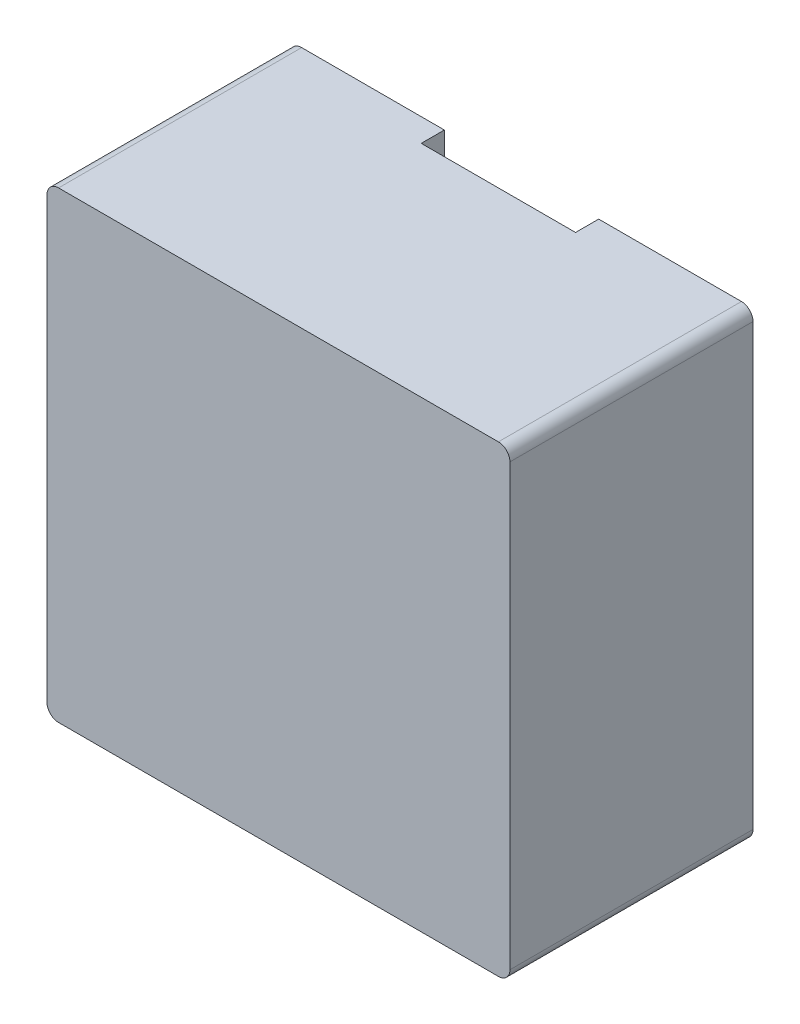
ISO-10303-21;
HEADER;
FILE_DESCRIPTION(('STEP AP214'),'2;1');
FILE_NAME('part.step','',(''),(''),'','','');
FILE_SCHEMA(('AUTOMOTIVE_DESIGN { 1 0 10303 214 1 1 1 1 }'));
ENDSEC;
DATA;
#1=APPLICATION_CONTEXT('core data for automotive mechanical design processes');
#2=APPLICATION_PROTOCOL_DEFINITION('international standard','automotive_design',2000,#1);
#3=PRODUCT_CONTEXT('',#1,'mechanical');
#4=PRODUCT('Part','Part','',(#3));
#5=PRODUCT_RELATED_PRODUCT_CATEGORY('part','',(#4));
#6=PRODUCT_DEFINITION_FORMATION('','',#4);
#7=PRODUCT_DEFINITION_CONTEXT('part definition',#1,'design');
#8=PRODUCT_DEFINITION('design','',#6,#7);
#9=PRODUCT_DEFINITION_SHAPE('','',#8);
#10=(LENGTH_UNIT() NAMED_UNIT(*) SI_UNIT(.MILLI.,.METRE.));
#11=(NAMED_UNIT(*) PLANE_ANGLE_UNIT() SI_UNIT($,.RADIAN.));
#12=(NAMED_UNIT(*) SI_UNIT($,.STERADIAN.) SOLID_ANGLE_UNIT());
#13=UNCERTAINTY_MEASURE_WITH_UNIT(LENGTH_MEASURE(1.E-05),#10,'distance_accuracy_value','');
#14=(GEOMETRIC_REPRESENTATION_CONTEXT(3) GLOBAL_UNCERTAINTY_ASSIGNED_CONTEXT((#13)) GLOBAL_UNIT_ASSIGNED_CONTEXT((#10,
#11,#12)) REPRESENTATION_CONTEXT('',''));
#15=CARTESIAN_POINT('',(0.,0.,0.));
#16=DIRECTION('',(0.,0.,1.));
#17=DIRECTION('',(1.,0.,0.));
#18=AXIS2_PLACEMENT_3D('',#15,#16,#17);
#19=CARTESIAN_POINT('',(0.,0.,0.));
#20=DIRECTION('',(0.,0.,-1.));
#21=DIRECTION('',(-1.,0.,0.));
#22=AXIS2_PLACEMENT_3D('',#19,#20,#21);
#23=PLANE('',#22);
#24=DIRECTION('',(0.,1.,0.));
#25=VECTOR('',#24,1.);
#26=CARTESIAN_POINT('',(-3.,-3.,0.));
#27=LINE('',#26,#25);
#28=CARTESIAN_POINT('',(-3.,-2.85,0.));
#29=VERTEX_POINT('',#28);
#30=CARTESIAN_POINT('',(-3.,2.85,0.));
#31=VERTEX_POINT('',#30);
#32=EDGE_CURVE('E185',#29,#31,#27,.T.);
#33=ORIENTED_EDGE('',*,*,#32,.T.);
#34=CARTESIAN_POINT('',(-2.85,2.85,0.));
#35=DIRECTION('',(0.,0.,-1.));
#36=DIRECTION('',(-1.,0.,0.));
#37=AXIS2_PLACEMENT_3D('',#34,#35,#36);
#38=CIRCLE('',#37,0.15);
#39=CARTESIAN_POINT('',(-2.85,3.,0.));
#40=VERTEX_POINT('',#39);
#41=EDGE_CURVE('E130',#31,#40,#38,.T.);
#42=ORIENTED_EDGE('',*,*,#41,.T.);
#43=DIRECTION('',(1.,0.,0.));
#44=VECTOR('',#43,1.);
#45=CARTESIAN_POINT('',(-3.,3.,0.));
#46=LINE('',#45,#44);
#47=CARTESIAN_POINT('',(-1.,3.,0.));
#48=VERTEX_POINT('',#47);
#49=EDGE_CURVE('E124',#40,#48,#46,.T.);
#50=ORIENTED_EDGE('',*,*,#49,.T.);
#51=DIRECTION('',(0.,-1.,0.));
#52=VECTOR('',#51,1.);
#53=CARTESIAN_POINT('',(-1.,3.,0.));
#54=LINE('',#53,#52);
#55=CARTESIAN_POINT('',(-1.,-3.,0.));
#56=VERTEX_POINT('',#55);
#57=EDGE_CURVE('E128',#48,#56,#54,.T.);
#58=ORIENTED_EDGE('',*,*,#57,.T.);
#59=DIRECTION('',(-1.,0.,0.));
#60=VECTOR('',#59,1.);
#61=CARTESIAN_POINT('',(3.,-3.,0.));
#62=LINE('',#61,#60);
#63=CARTESIAN_POINT('',(-2.85,-3.,0.));
#64=VERTEX_POINT('',#63);
#65=EDGE_CURVE('E182',#56,#64,#62,.T.);
#66=ORIENTED_EDGE('',*,*,#65,.T.);
#67=CARTESIAN_POINT('',(-2.85,-2.85,0.));
#68=DIRECTION('',(0.,0.,-1.));
#69=DIRECTION('',(-1.,0.,0.));
#70=AXIS2_PLACEMENT_3D('',#67,#68,#69);
#71=CIRCLE('',#70,0.15);
#72=EDGE_CURVE('E191',#64,#29,#71,.T.);
#73=ORIENTED_EDGE('',*,*,#72,.T.);
#74=EDGE_LOOP('',(#33,#42,#50,#58,#66,#73));
#75=FACE_BOUND('',#74,.T.);
#76=ADVANCED_FACE('F34',(#75),#23,.T.);
#77=CARTESIAN_POINT('',(3.,3.,3.15));
#78=DIRECTION('',(1.,0.,0.));
#79=DIRECTION('',(0.,0.,-1.));
#80=AXIS2_PLACEMENT_3D('',#77,#78,#79);
#81=PLANE('',#80);
#82=DIRECTION('',(0.,-1.,0.));
#83=VECTOR('',#82,1.);
#84=CARTESIAN_POINT('',(3.,3.,0.));
#85=LINE('',#84,#83);
#86=CARTESIAN_POINT('',(3.,2.85,0.));
#87=VERTEX_POINT('',#86);
#88=CARTESIAN_POINT('',(3.,-2.85,0.));
#89=VERTEX_POINT('',#88);
#90=EDGE_CURVE('E164',#87,#89,#85,.T.);
#91=ORIENTED_EDGE('',*,*,#90,.F.);
#92=DIRECTION('',(0.,0.,-1.));
#93=VECTOR('',#92,1.);
#94=CARTESIAN_POINT('',(3.,2.85,3.15));
#95=LINE('',#94,#93);
#96=CARTESIAN_POINT('',(3.,2.85,3.15));
#97=VERTEX_POINT('',#96);
#98=EDGE_CURVE('E11',#87,#97,#95,.F.);
#99=ORIENTED_EDGE('',*,*,#98,.T.);
#100=DIRECTION('',(0.,-1.,0.));
#101=VECTOR('',#100,1.);
#102=CARTESIAN_POINT('',(3.,3.,3.15));
#103=LINE('',#102,#101);
#104=CARTESIAN_POINT('',(3.,-2.85,3.15));
#105=VERTEX_POINT('',#104);
#106=EDGE_CURVE('E134',#97,#105,#103,.T.);
#107=ORIENTED_EDGE('',*,*,#106,.T.);
#108=DIRECTION('',(0.,0.,-1.));
#109=VECTOR('',#108,1.);
#110=CARTESIAN_POINT('',(3.,-2.85,3.15));
#111=LINE('',#110,#109);
#112=EDGE_CURVE('E42',#105,#89,#111,.T.);
#113=ORIENTED_EDGE('',*,*,#112,.T.);
#114=EDGE_LOOP('',(#91,#99,#107,#113));
#115=FACE_BOUND('',#114,.T.);
#116=ADVANCED_FACE('F214',(#115),#81,.T.);
#117=CARTESIAN_POINT('',(-3.,3.,3.15));
#118=DIRECTION('',(0.,1.,0.));
#119=DIRECTION('',(0.,0.,1.));
#120=AXIS2_PLACEMENT_3D('',#117,#118,#119);
#121=PLANE('',#120);
#122=ORIENTED_EDGE('',*,*,#49,.F.);
#123=DIRECTION('',(0.,0.,-1.));
#124=VECTOR('',#123,1.);
#125=CARTESIAN_POINT('',(-2.85,3.,3.15));
#126=LINE('',#125,#124);
#127=CARTESIAN_POINT('',(-2.85,3.,3.15));
#128=VERTEX_POINT('',#127);
#129=EDGE_CURVE('E197',#40,#128,#126,.F.);
#130=ORIENTED_EDGE('',*,*,#129,.T.);
#131=DIRECTION('',(1.,0.,0.));
#132=VECTOR('',#131,1.);
#133=CARTESIAN_POINT('',(-3.,3.,3.15));
#134=LINE('',#133,#132);
#135=CARTESIAN_POINT('',(2.85,3.,3.15));
#136=VERTEX_POINT('',#135);
#137=EDGE_CURVE('E177',#128,#136,#134,.T.);
#138=ORIENTED_EDGE('',*,*,#137,.T.);
#139=DIRECTION('',(0.,0.,-1.));
#140=VECTOR('',#139,1.);
#141=CARTESIAN_POINT('',(2.85,3.,3.15));
#142=LINE('',#141,#140);
#143=CARTESIAN_POINT('',(2.85,3.,0.));
#144=VERTEX_POINT('',#143);
#145=EDGE_CURVE('E194',#136,#144,#142,.T.);
#146=ORIENTED_EDGE('',*,*,#145,.T.);
#147=CARTESIAN_POINT('',(1.,3.,0.));
#148=VERTEX_POINT('',#147);
#149=EDGE_CURVE('E135',#148,#144,#46,.T.);
#150=ORIENTED_EDGE('',*,*,#149,.F.);
#151=DIRECTION('',(0.,0.,1.));
#152=VECTOR('',#151,1.);
#153=CARTESIAN_POINT('',(1.,3.,0.));
#154=LINE('',#153,#152);
#155=CARTESIAN_POINT('',(1.,3.,0.3));
#156=VERTEX_POINT('',#155);
#157=EDGE_CURVE('E150',#148,#156,#154,.T.);
#158=ORIENTED_EDGE('',*,*,#157,.T.);
#159=DIRECTION('',(-1.,0.,0.));
#160=VECTOR('',#159,1.);
#161=CARTESIAN_POINT('',(1.,3.,0.3));
#162=LINE('',#161,#160);
#163=CARTESIAN_POINT('',(-1.,3.,0.3));
#164=VERTEX_POINT('',#163);
#165=EDGE_CURVE('E145',#156,#164,#162,.T.);
#166=ORIENTED_EDGE('',*,*,#165,.T.);
#167=DIRECTION('',(0.,0.,-1.));
#168=VECTOR('',#167,1.);
#169=CARTESIAN_POINT('',(-1.,3.,0.3));
#170=LINE('',#169,#168);
#171=EDGE_CURVE('E140',#164,#48,#170,.T.);
#172=ORIENTED_EDGE('',*,*,#171,.T.);
#173=EDGE_LOOP('',(#122,#130,#138,#146,#150,#158,#166,#172));
#174=FACE_BOUND('',#173,.T.);
#175=ADVANCED_FACE('F147',(#174),#121,.T.);
#176=CARTESIAN_POINT('',(-3.,-3.,3.15));
#177=DIRECTION('',(-1.,0.,0.));
#178=DIRECTION('',(0.,0.,1.));
#179=AXIS2_PLACEMENT_3D('',#176,#177,#178);
#180=PLANE('',#179);
#181=DIRECTION('',(0.,1.,0.));
#182=VECTOR('',#181,1.);
#183=CARTESIAN_POINT('',(-3.,-3.,3.15));
#184=LINE('',#183,#182);
#185=CARTESIAN_POINT('',(-3.,-2.85,3.15));
#186=VERTEX_POINT('',#185);
#187=CARTESIAN_POINT('',(-3.,2.85,3.15));
#188=VERTEX_POINT('',#187);
#189=EDGE_CURVE('E174',#186,#188,#184,.T.);
#190=ORIENTED_EDGE('',*,*,#189,.T.);
#191=DIRECTION('',(0.,0.,-1.));
#192=VECTOR('',#191,1.);
#193=CARTESIAN_POINT('',(-3.,2.85,3.15));
#194=LINE('',#193,#192);
#195=EDGE_CURVE('E188',#188,#31,#194,.T.);
#196=ORIENTED_EDGE('',*,*,#195,.T.);
#197=ORIENTED_EDGE('',*,*,#32,.F.);
#198=DIRECTION('',(0.,0.,-1.));
#199=VECTOR('',#198,1.);
#200=CARTESIAN_POINT('',(-3.,-2.85,3.15));
#201=LINE('',#200,#199);
#202=EDGE_CURVE('E180',#29,#186,#201,.F.);
#203=ORIENTED_EDGE('',*,*,#202,.T.);
#204=EDGE_LOOP('',(#190,#196,#197,#203));
#205=FACE_BOUND('',#204,.T.);
#206=ADVANCED_FACE('F238',(#205),#180,.T.);
#207=CARTESIAN_POINT('',(3.,-3.,3.15));
#208=DIRECTION('',(0.,-1.,0.));
#209=DIRECTION('',(0.,0.,-1.));
#210=AXIS2_PLACEMENT_3D('',#207,#208,#209);
#211=PLANE('',#210);
#212=DIRECTION('',(-1.,0.,0.));
#213=VECTOR('',#212,1.);
#214=CARTESIAN_POINT('',(3.,-3.,3.15));
#215=LINE('',#214,#213);
#216=CARTESIAN_POINT('',(2.85,-3.,3.15));
#217=VERTEX_POINT('',#216);
#218=CARTESIAN_POINT('',(-2.85,-3.,3.15));
#219=VERTEX_POINT('',#218);
#220=EDGE_CURVE('E171',#217,#219,#215,.T.);
#221=ORIENTED_EDGE('',*,*,#220,.T.);
#222=DIRECTION('',(0.,0.,-1.));
#223=VECTOR('',#222,1.);
#224=CARTESIAN_POINT('',(-2.85,-3.,3.15));
#225=LINE('',#224,#223);
#226=EDGE_CURVE('E209',#219,#64,#225,.T.);
#227=ORIENTED_EDGE('',*,*,#226,.T.);
#228=ORIENTED_EDGE('',*,*,#65,.F.);
#229=DIRECTION('',(0.,0.,-1.));
#230=VECTOR('',#229,1.);
#231=CARTESIAN_POINT('',(-1.,-3.,0.3));
#232=LINE('',#231,#230);
#233=CARTESIAN_POINT('',(-1.,-3.,0.3));
#234=VERTEX_POINT('',#233);
#235=EDGE_CURVE('E143',#234,#56,#232,.T.);
#236=ORIENTED_EDGE('',*,*,#235,.F.);
#237=DIRECTION('',(-1.,0.,0.));
#238=VECTOR('',#237,1.);
#239=CARTESIAN_POINT('',(1.,-3.,0.3));
#240=LINE('',#239,#238);
#241=CARTESIAN_POINT('',(1.,-3.,0.3));
#242=VERTEX_POINT('',#241);
#243=EDGE_CURVE('E151',#242,#234,#240,.T.);
#244=ORIENTED_EDGE('',*,*,#243,.F.);
#245=DIRECTION('',(0.,0.,1.));
#246=VECTOR('',#245,1.);
#247=CARTESIAN_POINT('',(1.,-3.,0.));
#248=LINE('',#247,#246);
#249=CARTESIAN_POINT('',(1.,-3.,0.));
#250=VERTEX_POINT('',#249);
#251=EDGE_CURVE('E155',#250,#242,#248,.T.);
#252=ORIENTED_EDGE('',*,*,#251,.F.);
#253=CARTESIAN_POINT('',(2.85,-3.,0.));
#254=VERTEX_POINT('',#253);
#255=EDGE_CURVE('E183',#254,#250,#62,.T.);
#256=ORIENTED_EDGE('',*,*,#255,.F.);
#257=DIRECTION('',(0.,0.,-1.));
#258=VECTOR('',#257,1.);
#259=CARTESIAN_POINT('',(2.85,-3.,3.15));
#260=LINE('',#259,#258);
#261=EDGE_CURVE('E207',#254,#217,#260,.F.);
#262=ORIENTED_EDGE('',*,*,#261,.T.);
#263=EDGE_LOOP('',(#221,#227,#228,#236,#244,#252,#256,#262));
#264=FACE_BOUND('',#263,.T.);
#265=ADVANCED_FACE('F223',(#264),#211,.T.);
#266=CARTESIAN_POINT('',(0.,0.,3.15));
#267=DIRECTION('',(0.,0.,-1.));
#268=DIRECTION('',(-1.,0.,0.));
#269=AXIS2_PLACEMENT_3D('',#266,#267,#268);
#270=PLANE('',#269);
#271=ORIENTED_EDGE('',*,*,#137,.F.);
#272=CARTESIAN_POINT('',(-2.85,2.85,3.15));
#273=DIRECTION('',(0.,0.,-1.));
#274=DIRECTION('',(-1.,0.,0.));
#275=AXIS2_PLACEMENT_3D('',#272,#273,#274);
#276=CIRCLE('',#275,0.15);
#277=EDGE_CURVE('E205',#128,#188,#276,.F.);
#278=ORIENTED_EDGE('',*,*,#277,.T.);
#279=ORIENTED_EDGE('',*,*,#189,.F.);
#280=CARTESIAN_POINT('',(-2.85,-2.85,3.15));
#281=DIRECTION('',(0.,0.,-1.));
#282=DIRECTION('',(-1.,0.,0.));
#283=AXIS2_PLACEMENT_3D('',#280,#281,#282);
#284=CIRCLE('',#283,0.15);
#285=EDGE_CURVE('E203',#186,#219,#284,.F.);
#286=ORIENTED_EDGE('',*,*,#285,.T.);
#287=ORIENTED_EDGE('',*,*,#220,.F.);
#288=CARTESIAN_POINT('',(2.85,-2.85,3.15));
#289=DIRECTION('',(0.,0.,-1.));
#290=DIRECTION('',(-1.,0.,0.));
#291=AXIS2_PLACEMENT_3D('',#288,#289,#290);
#292=CIRCLE('',#291,0.15);
#293=EDGE_CURVE('E199',#217,#105,#292,.F.);
#294=ORIENTED_EDGE('',*,*,#293,.T.);
#295=ORIENTED_EDGE('',*,*,#106,.F.);
#296=CARTESIAN_POINT('',(2.85,2.85,3.15));
#297=DIRECTION('',(0.,0.,-1.));
#298=DIRECTION('',(-1.,0.,0.));
#299=AXIS2_PLACEMENT_3D('',#296,#297,#298);
#300=CIRCLE('',#299,0.15);
#301=EDGE_CURVE('E201',#97,#136,#300,.F.);
#302=ORIENTED_EDGE('',*,*,#301,.T.);
#303=EDGE_LOOP('',(#271,#278,#279,#286,#287,#294,#295,#302));
#304=FACE_BOUND('',#303,.T.);
#305=ADVANCED_FACE('F228',(#304),#270,.F.);
#306=ORIENTED_EDGE('',*,*,#149,.T.);
#307=CARTESIAN_POINT('',(2.85,2.85,0.));
#308=DIRECTION('',(0.,0.,-1.));
#309=DIRECTION('',(-1.,0.,0.));
#310=AXIS2_PLACEMENT_3D('',#307,#308,#309);
#311=CIRCLE('',#310,0.15);
#312=EDGE_CURVE('E57',#144,#87,#311,.T.);
#313=ORIENTED_EDGE('',*,*,#312,.T.);
#314=ORIENTED_EDGE('',*,*,#90,.T.);
#315=CARTESIAN_POINT('',(2.85,-2.85,0.));
#316=DIRECTION('',(0.,0.,-1.));
#317=DIRECTION('',(-1.,0.,0.));
#318=AXIS2_PLACEMENT_3D('',#315,#316,#317);
#319=CIRCLE('',#318,0.15);
#320=EDGE_CURVE('E49',#89,#254,#319,.T.);
#321=ORIENTED_EDGE('',*,*,#320,.T.);
#322=ORIENTED_EDGE('',*,*,#255,.T.);
#323=DIRECTION('',(0.,-1.,0.));
#324=VECTOR('',#323,1.);
#325=CARTESIAN_POINT('',(1.,3.,0.));
#326=LINE('',#325,#324);
#327=EDGE_CURVE('E144',#148,#250,#326,.T.);
#328=ORIENTED_EDGE('',*,*,#327,.F.);
#329=EDGE_LOOP('',(#306,#313,#314,#321,#322,#328));
#330=FACE_BOUND('',#329,.T.);
#331=ADVANCED_FACE('F218',(#330),#23,.T.);
#332=CARTESIAN_POINT('',(-1.,3.,0.3));
#333=DIRECTION('',(-1.,0.,0.));
#334=DIRECTION('',(0.,0.,1.));
#335=AXIS2_PLACEMENT_3D('',#332,#333,#334);
#336=PLANE('',#335);
#337=ORIENTED_EDGE('',*,*,#235,.T.);
#338=ORIENTED_EDGE('',*,*,#57,.F.);
#339=ORIENTED_EDGE('',*,*,#171,.F.);
#340=DIRECTION('',(0.,-1.,0.));
#341=VECTOR('',#340,1.);
#342=CARTESIAN_POINT('',(-1.,3.,0.3));
#343=LINE('',#342,#341);
#344=EDGE_CURVE('E162',#164,#234,#343,.T.);
#345=ORIENTED_EDGE('',*,*,#344,.T.);
#346=EDGE_LOOP('',(#337,#338,#339,#345));
#347=FACE_BOUND('',#346,.T.);
#348=ADVANCED_FACE('F139',(#347),#336,.F.);
#349=CARTESIAN_POINT('',(1.,3.,0.3));
#350=DIRECTION('',(0.,0.,1.));
#351=DIRECTION('',(1.,0.,0.));
#352=AXIS2_PLACEMENT_3D('',#349,#350,#351);
#353=PLANE('',#352);
#354=ORIENTED_EDGE('',*,*,#243,.T.);
#355=ORIENTED_EDGE('',*,*,#344,.F.);
#356=ORIENTED_EDGE('',*,*,#165,.F.);
#357=DIRECTION('',(0.,-1.,0.));
#358=VECTOR('',#357,1.);
#359=CARTESIAN_POINT('',(1.,3.,0.3));
#360=LINE('',#359,#358);
#361=EDGE_CURVE('E165',#156,#242,#360,.T.);
#362=ORIENTED_EDGE('',*,*,#361,.T.);
#363=EDGE_LOOP('',(#354,#355,#356,#362));
#364=FACE_BOUND('',#363,.T.);
#365=ADVANCED_FACE('F250',(#364),#353,.F.);
#366=CARTESIAN_POINT('',(1.,3.,0.));
#367=DIRECTION('',(1.,0.,0.));
#368=DIRECTION('',(0.,0.,-1.));
#369=AXIS2_PLACEMENT_3D('',#366,#367,#368);
#370=PLANE('',#369);
#371=ORIENTED_EDGE('',*,*,#251,.T.);
#372=ORIENTED_EDGE('',*,*,#361,.F.);
#373=ORIENTED_EDGE('',*,*,#157,.F.);
#374=ORIENTED_EDGE('',*,*,#327,.T.);
#375=EDGE_LOOP('',(#371,#372,#373,#374));
#376=FACE_BOUND('',#375,.T.);
#377=ADVANCED_FACE('F248',(#376),#370,.F.);
#378=CARTESIAN_POINT('',(-2.85,2.85,3.15));
#379=DIRECTION('',(0.,0.,-1.));
#380=DIRECTION('',(-1.,0.,0.));
#381=AXIS2_PLACEMENT_3D('',#378,#379,#380);
#382=CYLINDRICAL_SURFACE('',#381,0.15);
#383=ORIENTED_EDGE('',*,*,#277,.F.);
#384=ORIENTED_EDGE('',*,*,#129,.F.);
#385=ORIENTED_EDGE('',*,*,#41,.F.);
#386=ORIENTED_EDGE('',*,*,#195,.F.);
#387=EDGE_LOOP('',(#383,#384,#385,#386));
#388=FACE_BOUND('',#387,.T.);
#389=ADVANCED_FACE('F242',(#388),#382,.T.);
#390=CARTESIAN_POINT('',(-2.85,-2.85,3.15));
#391=DIRECTION('',(0.,0.,-1.));
#392=DIRECTION('',(-1.,0.,0.));
#393=AXIS2_PLACEMENT_3D('',#390,#391,#392);
#394=CYLINDRICAL_SURFACE('',#393,0.15);
#395=ORIENTED_EDGE('',*,*,#285,.F.);
#396=ORIENTED_EDGE('',*,*,#202,.F.);
#397=ORIENTED_EDGE('',*,*,#72,.F.);
#398=ORIENTED_EDGE('',*,*,#226,.F.);
#399=EDGE_LOOP('',(#395,#396,#397,#398));
#400=FACE_BOUND('',#399,.T.);
#401=ADVANCED_FACE('F234',(#400),#394,.T.);
#402=CARTESIAN_POINT('',(2.85,2.85,3.15));
#403=DIRECTION('',(0.,0.,-1.));
#404=DIRECTION('',(-1.,0.,0.));
#405=AXIS2_PLACEMENT_3D('',#402,#403,#404);
#406=CYLINDRICAL_SURFACE('',#405,0.15);
#407=ORIENTED_EDGE('',*,*,#301,.F.);
#408=ORIENTED_EDGE('',*,*,#98,.F.);
#409=ORIENTED_EDGE('',*,*,#312,.F.);
#410=ORIENTED_EDGE('',*,*,#145,.F.);
#411=EDGE_LOOP('',(#407,#408,#409,#410));
#412=FACE_BOUND('',#411,.T.);
#413=ADVANCED_FACE('F245',(#412),#406,.T.);
#414=CARTESIAN_POINT('',(2.85,-2.85,3.15));
#415=DIRECTION('',(0.,0.,-1.));
#416=DIRECTION('',(-1.,0.,0.));
#417=AXIS2_PLACEMENT_3D('',#414,#415,#416);
#418=CYLINDRICAL_SURFACE('',#417,0.15);
#419=ORIENTED_EDGE('',*,*,#293,.F.);
#420=ORIENTED_EDGE('',*,*,#261,.F.);
#421=ORIENTED_EDGE('',*,*,#320,.F.);
#422=ORIENTED_EDGE('',*,*,#112,.F.);
#423=EDGE_LOOP('',(#419,#420,#421,#422));
#424=FACE_BOUND('',#423,.T.);
#425=ADVANCED_FACE('F36',(#424),#418,.T.);
#426=CLOSED_SHELL('',(#76,#116,#175,#206,#265,#305,#331,#348,#365,#377,#389,#401,#413,#425));
#427=MANIFOLD_SOLID_BREP('B2',#426);
#428=ADVANCED_BREP_SHAPE_REPRESENTATION('',(#18,#427),#14);
#429=SHAPE_DEFINITION_REPRESENTATION(#9,#428);
ENDSEC;
END-ISO-10303-21;
